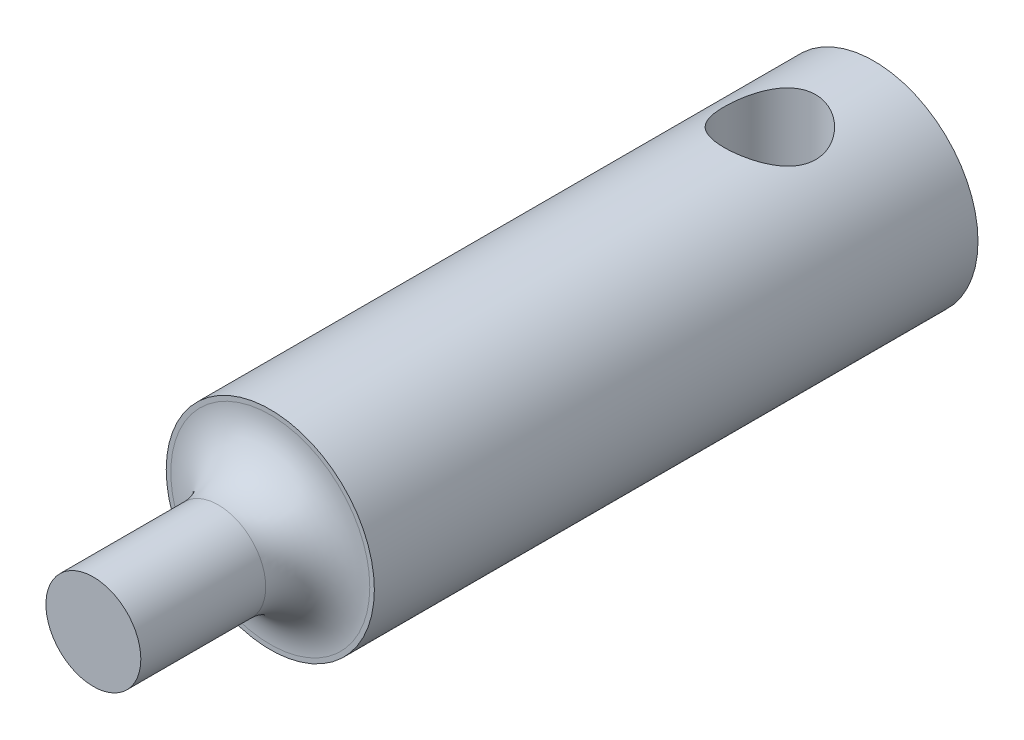
ISO-10303-21;
HEADER;
FILE_DESCRIPTION(('STEP AP214'),'2;1');
FILE_NAME('part.step','',(''),(''),'','','');
FILE_SCHEMA(('AUTOMOTIVE_DESIGN { 1 0 10303 214 1 1 1 1 }'));
ENDSEC;
DATA;
#1=APPLICATION_CONTEXT('core data for automotive mechanical design processes');
#2=APPLICATION_PROTOCOL_DEFINITION('international standard','automotive_design',2000,#1);
#3=PRODUCT_CONTEXT('',#1,'mechanical');
#4=PRODUCT('Part','Part','',(#3));
#5=PRODUCT_RELATED_PRODUCT_CATEGORY('part','',(#4));
#6=PRODUCT_DEFINITION_FORMATION('','',#4);
#7=PRODUCT_DEFINITION_CONTEXT('part definition',#1,'design');
#8=PRODUCT_DEFINITION('design','',#6,#7);
#9=PRODUCT_DEFINITION_SHAPE('','',#8);
#10=(LENGTH_UNIT() NAMED_UNIT(*) SI_UNIT(.MILLI.,.METRE.));
#11=(NAMED_UNIT(*) PLANE_ANGLE_UNIT() SI_UNIT($,.RADIAN.));
#12=(NAMED_UNIT(*) SI_UNIT($,.STERADIAN.) SOLID_ANGLE_UNIT());
#13=UNCERTAINTY_MEASURE_WITH_UNIT(LENGTH_MEASURE(1.E-05),#10,'distance_accuracy_value','');
#14=(GEOMETRIC_REPRESENTATION_CONTEXT(3) GLOBAL_UNCERTAINTY_ASSIGNED_CONTEXT((#13)) GLOBAL_UNIT_ASSIGNED_CONTEXT((#10,
#11,#12)) REPRESENTATION_CONTEXT('',''));
#15=CARTESIAN_POINT('',(0.,0.,0.));
#16=DIRECTION('',(0.,0.,1.));
#17=DIRECTION('',(1.,0.,0.));
#18=AXIS2_PLACEMENT_3D('',#15,#16,#17);
#19=CARTESIAN_POINT('',(0.,0.,18.415));
#20=DIRECTION('',(0.,0.,-1.));
#21=DIRECTION('',(-1.,0.,0.));
#22=AXIS2_PLACEMENT_3D('',#19,#20,#21);
#23=CYLINDRICAL_SURFACE('',#22,3.175);
#24=CARTESIAN_POINT('',(0.,-3.175,4.572));
#25=CARTESIAN_POINT('',(0.0744564190651468,-3.1749972697175,4.57199664569768));
#26=CARTESIAN_POINT('',(0.149031273122387,-3.17235155801961,4.56601246659158));
#27=CARTESIAN_POINT('',(0.296039798164434,-3.16203174722011,4.5423109077335));
#28=CARTESIAN_POINT('',(0.368467798046776,-3.15434538934556,4.52456492232665));
#29=CARTESIAN_POINT('',(0.508823263085735,-3.1347611016683,4.47813115421474));
#30=CARTESIAN_POINT('',(0.57676567151627,-3.12287809055694,4.44948210319816));
#31=CARTESIAN_POINT('',(0.706806619866245,-3.09603999620989,4.38222661670943));
#32=CARTESIAN_POINT('',(0.768906557449635,-3.0810856504523,4.34362257102795));
#33=CARTESIAN_POINT('',(0.889001385568666,-3.04866561325675,4.2553306209959));
#34=CARTESIAN_POINT('',(0.94663570241052,-3.03111173335851,4.20518498376154));
#35=CARTESIAN_POINT('',(1.05299304784798,-2.99582653314941,4.09620448690013));
#36=CARTESIAN_POINT('',(1.10171086925443,-2.97809511549147,4.03736458588414));
#37=CARTESIAN_POINT('',(1.19157494413013,-2.94333608827926,3.90865994367032));
#38=CARTESIAN_POINT('',(1.23214034265897,-2.9264043383319,3.83836095590894));
#39=CARTESIAN_POINT('',(1.30071006133891,-2.89658190749762,3.69109012039759));
#40=CARTESIAN_POINT('',(1.32872157589198,-2.88368891335211,3.61412212479435));
#41=CARTESIAN_POINT('',(1.36985689697246,-2.8643694564486,3.45984514555113));
#42=CARTESIAN_POINT('',(1.38367826410125,-2.8576419635905,3.38276141789925));
#43=CARTESIAN_POINT('',(1.39821119689305,-2.85056187101853,3.2270982331114));
#44=CARTESIAN_POINT('',(1.39893125309836,-2.8502051426179,3.1485197777215));
#45=CARTESIAN_POINT('',(1.38776218669604,-2.85565516755235,2.99943869373256));
#46=CARTESIAN_POINT('',(1.37696906778601,-2.8609262205847,2.92883023597399));
#47=CARTESIAN_POINT('',(1.34493440853301,-2.8761236727019,2.79055302897992));
#48=CARTESIAN_POINT('',(1.32369058064341,-2.88605109099235,2.7228849268872));
#49=CARTESIAN_POINT('',(1.27093683353658,-2.90967222295584,2.59060786925034));
#50=CARTESIAN_POINT('',(1.23920866348139,-2.92344494589061,2.52610070597666));
#51=CARTESIAN_POINT('',(1.16654335034618,-2.95319161304987,2.40305684964162));
#52=CARTESIAN_POINT('',(1.12560236509517,-2.9691664745883,2.34452266243439));
#53=CARTESIAN_POINT('',(1.03110264439394,-3.00336594395861,2.2292157740948));
#54=CARTESIAN_POINT('',(0.976713392224455,-3.02165988813625,2.17314221961801));
#55=CARTESIAN_POINT('',(0.859144915804759,-3.05716600774922,2.07066209299836));
#56=CARTESIAN_POINT('',(0.795963146130486,-3.07437786782005,2.02425832999984));
#57=CARTESIAN_POINT('',(0.660269140668879,-3.10638995837448,1.94124419099494));
#58=CARTESIAN_POINT('',(0.587542737922723,-3.1211077325569,1.90494968125079));
#59=CARTESIAN_POINT('',(0.436202575205566,-3.14582497447425,1.84536157849426));
#60=CARTESIAN_POINT('',(0.35759248621454,-3.15582735628942,1.8220599543355));
#61=CARTESIAN_POINT('',(0.202531325958193,-3.16942296938574,1.79065509209408));
#62=CARTESIAN_POINT('',(0.126304497724904,-3.17341020374002,1.78161555070473));
#63=CARTESIAN_POINT('',(-0.0266763697646318,-3.17580819231337,1.77616127781661));
#64=CARTESIAN_POINT('',(-0.103430226294036,-3.17422079064172,1.77974237136863));
#65=CARTESIAN_POINT('',(-0.250692367232269,-3.16589865049171,1.79878666713704));
#66=CARTESIAN_POINT('',(-0.321308044540988,-3.15946081694563,1.81356476180629));
#67=CARTESIAN_POINT('',(-0.458963554091254,-3.1424179690666,1.85359863621278));
#68=CARTESIAN_POINT('',(-0.526002947592838,-3.13181244476883,1.87885569819313));
#69=CARTESIAN_POINT('',(-0.656978790496382,-3.10702227209116,1.93993998957008));
#70=CARTESIAN_POINT('',(-0.720752909290198,-3.0927361748571,1.97607274267112));
#71=CARTESIAN_POINT('',(-0.841562873448109,-3.06207246558877,2.05754961123733));
#72=CARTESIAN_POINT('',(-0.898595780339054,-3.04569394790049,2.10289772039836));
#73=CARTESIAN_POINT('',(-1.00906061977775,-3.01098555163604,2.20570180674664));
#74=CARTESIAN_POINT('',(-1.06185039988072,-2.99260382159021,2.26383196590513));
#75=CARTESIAN_POINT('',(-1.1571355626495,-2.95706854819179,2.38836436486096));
#76=CARTESIAN_POINT('',(-1.19962752615985,-2.93991541409454,2.45476934107198));
#77=CARTESIAN_POINT('',(-1.27389206106194,-2.90852043596717,2.59594638605302));
#78=CARTESIAN_POINT('',(-1.3054099402624,-2.8943504473103,2.67086965374689));
#79=CARTESIAN_POINT('',(-1.35508629145144,-2.871433087851,2.82578643723246));
#80=CARTESIAN_POINT('',(-1.37325750086315,-2.86268054815289,2.90577503949501));
#81=CARTESIAN_POINT('',(-1.3943933250109,-2.85244063214946,3.06135249252185));
#82=CARTESIAN_POINT('',(-1.39850196981022,-2.85040717538275,3.13675030484026));
#83=CARTESIAN_POINT('',(-1.39452092871853,-2.85235733736492,3.28713534767706));
#84=CARTESIAN_POINT('',(-1.38643370787601,-2.85633974017861,3.36212265809239));
#85=CARTESIAN_POINT('',(-1.35928595154649,-2.86935021801101,3.50505956379995));
#86=CARTESIAN_POINT('',(-1.34088686632541,-2.87807326788967,3.57316539449726));
#87=CARTESIAN_POINT('',(-1.2943270389732,-2.89930915603842,3.70531921774281));
#88=CARTESIAN_POINT('',(-1.26616348853013,-2.9118230844544,3.76936603662299));
#89=CARTESIAN_POINT('',(-1.19882490164752,-2.94021388830471,3.89603804310713));
#90=CARTESIAN_POINT('',(-1.15906396619681,-2.95625390695898,3.95831440589764));
#91=CARTESIAN_POINT('',(-1.0704298381241,-2.9894888872669,4.07566700131294));
#92=CARTESIAN_POINT('',(-1.02155293772951,-3.00668431703843,4.13074028864065));
#93=CARTESIAN_POINT('',(-0.911158079874127,-3.04204692329221,4.23695709696283));
#94=CARTESIAN_POINT('',(-0.848918667862615,-3.06017241605804,4.28736837543166));
#95=CARTESIAN_POINT('',(-0.716221106903045,-3.09391870147354,4.37710207851786));
#96=CARTESIAN_POINT('',(-0.645759238401422,-3.10953835292118,4.41641945693781));
#97=CARTESIAN_POINT('',(-0.499332328363888,-3.13636159423796,4.482149208206));
#98=CARTESIAN_POINT('',(-0.423445645742702,-3.14761714397743,4.50871438031501));
#99=CARTESIAN_POINT('',(-0.267788117469725,-3.16464838557443,4.54843025354274));
#100=CARTESIAN_POINT('',(-0.188029968198447,-3.17044086511387,4.56162205962014));
#101=CARTESIAN_POINT('',(-0.0898516016685383,-3.17377982747286,4.56922439020011));
#102=CARTESIAN_POINT('',(-0.0719020478213308,-3.17423662761183,4.57026429916457));
#103=CARTESIAN_POINT('',(-0.0359706339290712,-3.17484704521294,4.57165251272826));
#104=CARTESIAN_POINT('',(-0.017988773562416,-3.17500065964002,4.57200081040407));
#105=CARTESIAN_POINT('',(0.,-3.175,4.572));
#106=B_SPLINE_CURVE_WITH_KNOTS('',3,(#24,#25,#26,#27,#28,#29,#30,#31,#32,#33,#34,#35,#36,#37,
#38,#39,#40,#41,#42,#43,#44,#45,#46,#47,#48,#49,#50,#51,#52,#53,#54,#55,#56,#57,#58,#59,#60,#61,
#62,#63,#64,#65,#66,#67,#68,#69,#70,#71,#72,#73,#74,#75,#76,#77,#78,#79,#80,#81,#82,#83,#84,#85,
#86,#87,#88,#89,#90,#91,#92,#93,#94,#95,#96,#97,#98,#99,#100,#101,#102,#103,#104,#105),
.UNSPECIFIED.,.T.,.F.,(4,2,2,2,2,2,2,2,2,2,2,2,2,2,2,2,2,2,2,2,2,2,2,2,2,2,2,2,2,2,2,2,2,2,2,2,
2,2,2,2,4),(0.,0.223295218591963,0.447135511662714,0.670187954010603,0.893186900274792,
1.1273373394776,1.36162408806784,1.60910396658315,1.85644183696743,2.09093583844034,
2.3252778664034,2.53914850430462,2.75306597700807,2.97175108558556,3.19052756557462,
3.43014775773771,3.66983746455175,3.91634027214457,4.16269054233982,4.39207237099429,
4.62137832647887,4.83768488917245,5.05401792770384,5.27710827188312,5.50029550459777,
5.74114517889955,5.98207471262448,6.22827213612666,6.47423429420711,6.69963893554446,
6.92499802382995,7.13732805318697,7.34971920051268,7.57560381775455,7.80158051109822,
8.04677045714774,8.29207175174142,8.53435551125926,8.77589229817806,8.82984019099,
8.8837886238485),.UNSPECIFIED.);
#107=CARTESIAN_POINT('',(0.,-3.175,4.572));
#108=VERTEX_POINT('',#107);
#109=EDGE_CURVE('E10',#108,#108,#106,.T.);
#110=ORIENTED_EDGE('',*,*,#109,.T.);
#111=EDGE_LOOP('',(#110));
#112=FACE_BOUND('',#111,.T.);
#113=CARTESIAN_POINT('',(0.,3.175,4.572));
#114=CARTESIAN_POINT('',(-0.0744564190651468,3.1749972697175,4.57199664569768));
#115=CARTESIAN_POINT('',(-0.149031273122387,3.17235155801961,4.56601246659158));
#116=CARTESIAN_POINT('',(-0.296039798164434,3.16203174722011,4.5423109077335));
#117=CARTESIAN_POINT('',(-0.368467798046776,3.15434538934556,4.52456492232665));
#118=CARTESIAN_POINT('',(-0.508823263085735,3.1347611016683,4.47813115421474));
#119=CARTESIAN_POINT('',(-0.57676567151627,3.12287809055694,4.44948210319816));
#120=CARTESIAN_POINT('',(-0.706806619866245,3.09603999620989,4.38222661670943));
#121=CARTESIAN_POINT('',(-0.768906557449635,3.0810856504523,4.34362257102795));
#122=CARTESIAN_POINT('',(-0.889001385568666,3.04866561325675,4.2553306209959));
#123=CARTESIAN_POINT('',(-0.94663570241052,3.03111173335851,4.20518498376154));
#124=CARTESIAN_POINT('',(-1.05299304784798,2.99582653314941,4.09620448690013));
#125=CARTESIAN_POINT('',(-1.10171086925443,2.97809511549147,4.03736458588414));
#126=CARTESIAN_POINT('',(-1.19157494413013,2.94333608827926,3.90865994367032));
#127=CARTESIAN_POINT('',(-1.23214034265897,2.9264043383319,3.83836095590894));
#128=CARTESIAN_POINT('',(-1.30071006133891,2.89658190749762,3.69109012039759));
#129=CARTESIAN_POINT('',(-1.32872157589198,2.88368891335211,3.61412212479435));
#130=CARTESIAN_POINT('',(-1.36985689697246,2.8643694564486,3.45984514555113));
#131=CARTESIAN_POINT('',(-1.38367826410125,2.8576419635905,3.38276141789925));
#132=CARTESIAN_POINT('',(-1.39821119689305,2.85056187101853,3.2270982331114));
#133=CARTESIAN_POINT('',(-1.39893125309836,2.8502051426179,3.1485197777215));
#134=CARTESIAN_POINT('',(-1.38776218669604,2.85565516755235,2.99943869373256));
#135=CARTESIAN_POINT('',(-1.37696906778601,2.8609262205847,2.92883023597399));
#136=CARTESIAN_POINT('',(-1.34493440853301,2.8761236727019,2.79055302897992));
#137=CARTESIAN_POINT('',(-1.32369058064341,2.88605109099235,2.7228849268872));
#138=CARTESIAN_POINT('',(-1.27093683353658,2.90967222295584,2.59060786925034));
#139=CARTESIAN_POINT('',(-1.23920866348139,2.92344494589061,2.52610070597666));
#140=CARTESIAN_POINT('',(-1.16654335034618,2.95319161304987,2.40305684964162));
#141=CARTESIAN_POINT('',(-1.12560236509517,2.9691664745883,2.34452266243439));
#142=CARTESIAN_POINT('',(-1.03110264439394,3.00336594395861,2.2292157740948));
#143=CARTESIAN_POINT('',(-0.976713392224455,3.02165988813625,2.17314221961801));
#144=CARTESIAN_POINT('',(-0.859144915804759,3.05716600774922,2.07066209299836));
#145=CARTESIAN_POINT('',(-0.795963146130486,3.07437786782005,2.02425832999984));
#146=CARTESIAN_POINT('',(-0.660269140668879,3.10638995837448,1.94124419099494));
#147=CARTESIAN_POINT('',(-0.587542737922723,3.1211077325569,1.90494968125079));
#148=CARTESIAN_POINT('',(-0.436202575205566,3.14582497447425,1.84536157849426));
#149=CARTESIAN_POINT('',(-0.35759248621454,3.15582735628942,1.8220599543355));
#150=CARTESIAN_POINT('',(-0.202531325958193,3.16942296938574,1.79065509209408));
#151=CARTESIAN_POINT('',(-0.126304497724904,3.17341020374002,1.78161555070473));
#152=CARTESIAN_POINT('',(0.0266763697646318,3.17580819231337,1.77616127781661));
#153=CARTESIAN_POINT('',(0.103430226294036,3.17422079064172,1.77974237136863));
#154=CARTESIAN_POINT('',(0.250692367232269,3.16589865049171,1.79878666713704));
#155=CARTESIAN_POINT('',(0.321308044540988,3.15946081694563,1.81356476180629));
#156=CARTESIAN_POINT('',(0.458963554091254,3.1424179690666,1.85359863621278));
#157=CARTESIAN_POINT('',(0.526002947592838,3.13181244476883,1.87885569819313));
#158=CARTESIAN_POINT('',(0.656978790496382,3.10702227209116,1.93993998957008));
#159=CARTESIAN_POINT('',(0.720752909290198,3.0927361748571,1.97607274267112));
#160=CARTESIAN_POINT('',(0.841562873448109,3.06207246558877,2.05754961123733));
#161=CARTESIAN_POINT('',(0.898595780339054,3.04569394790049,2.10289772039836));
#162=CARTESIAN_POINT('',(1.00906061977775,3.01098555163604,2.20570180674664));
#163=CARTESIAN_POINT('',(1.06185039988072,2.99260382159021,2.26383196590513));
#164=CARTESIAN_POINT('',(1.1571355626495,2.95706854819179,2.38836436486096));
#165=CARTESIAN_POINT('',(1.19962752615985,2.93991541409454,2.45476934107198));
#166=CARTESIAN_POINT('',(1.27389206106194,2.90852043596717,2.59594638605302));
#167=CARTESIAN_POINT('',(1.3054099402624,2.8943504473103,2.67086965374689));
#168=CARTESIAN_POINT('',(1.35508629145144,2.871433087851,2.82578643723246));
#169=CARTESIAN_POINT('',(1.37325750086315,2.86268054815289,2.90577503949501));
#170=CARTESIAN_POINT('',(1.3943933250109,2.85244063214946,3.06135249252185));
#171=CARTESIAN_POINT('',(1.39850196981022,2.85040717538275,3.13675030484026));
#172=CARTESIAN_POINT('',(1.39452092871853,2.85235733736492,3.28713534767706));
#173=CARTESIAN_POINT('',(1.38643370787601,2.85633974017861,3.36212265809239));
#174=CARTESIAN_POINT('',(1.35928595154649,2.86935021801101,3.50505956379995));
#175=CARTESIAN_POINT('',(1.34088686632541,2.87807326788967,3.57316539449726));
#176=CARTESIAN_POINT('',(1.2943270389732,2.89930915603842,3.70531921774281));
#177=CARTESIAN_POINT('',(1.26616348853013,2.9118230844544,3.76936603662299));
#178=CARTESIAN_POINT('',(1.19882490164752,2.94021388830471,3.89603804310713));
#179=CARTESIAN_POINT('',(1.15906396619681,2.95625390695898,3.95831440589764));
#180=CARTESIAN_POINT('',(1.0704298381241,2.9894888872669,4.07566700131294));
#181=CARTESIAN_POINT('',(1.02155293772951,3.00668431703843,4.13074028864065));
#182=CARTESIAN_POINT('',(0.911158079874127,3.04204692329221,4.23695709696283));
#183=CARTESIAN_POINT('',(0.848918667862615,3.06017241605804,4.28736837543166));
#184=CARTESIAN_POINT('',(0.716221106903045,3.09391870147354,4.37710207851786));
#185=CARTESIAN_POINT('',(0.645759238401422,3.10953835292118,4.41641945693781));
#186=CARTESIAN_POINT('',(0.499332328363888,3.13636159423796,4.482149208206));
#187=CARTESIAN_POINT('',(0.423445645742702,3.14761714397743,4.50871438031501));
#188=CARTESIAN_POINT('',(0.267788117469725,3.16464838557443,4.54843025354274));
#189=CARTESIAN_POINT('',(0.188029968198447,3.17044086511387,4.56162205962014));
#190=CARTESIAN_POINT('',(0.0898516016685383,3.17377982747286,4.56922439020011));
#191=CARTESIAN_POINT('',(0.0719020478213308,3.17423662761183,4.57026429916457));
#192=CARTESIAN_POINT('',(0.0359706339290712,3.17484704521294,4.57165251272826));
#193=CARTESIAN_POINT('',(0.017988773562416,3.17500065964002,4.57200081040407));
#194=CARTESIAN_POINT('',(0.,3.175,4.572));
#195=B_SPLINE_CURVE_WITH_KNOTS('',3,(#113,#114,#115,#116,#117,#118,#119,#120,#121,#122,#123,
#124,#125,#126,#127,#128,#129,#130,#131,#132,#133,#134,#135,#136,#137,#138,#139,#140,#141,#142,
#143,#144,#145,#146,#147,#148,#149,#150,#151,#152,#153,#154,#155,#156,#157,#158,#159,#160,#161,
#162,#163,#164,#165,#166,#167,#168,#169,#170,#171,#172,#173,#174,#175,#176,#177,#178,#179,#180,
#181,#182,#183,#184,#185,#186,#187,#188,#189,#190,#191,#192,#193,#194),.UNSPECIFIED.,.T.,.F.,(4,
2,2,2,2,2,2,2,2,2,2,2,2,2,2,2,2,2,2,2,2,2,2,2,2,2,2,2,2,2,2,2,2,2,2,2,2,2,2,2,4),(0.,
0.223295218591963,0.447135511662714,0.670187954010603,0.893186900274792,1.1273373394776,
1.36162408806784,1.60910396658315,1.85644183696743,2.09093583844034,2.3252778664034,
2.53914850430462,2.75306597700807,2.97175108558556,3.19052756557462,3.43014775773771,
3.66983746455175,3.91634027214457,4.16269054233982,4.39207237099429,4.62137832647887,
4.83768488917245,5.05401792770384,5.27710827188312,5.50029550459777,5.74114517889955,
5.98207471262448,6.22827213612666,6.47423429420711,6.69963893554446,6.92499802382995,
7.13732805318697,7.34971920051268,7.57560381775455,7.80158051109822,8.04677045714774,
8.29207175174142,8.53435551125926,8.77589229817806,8.82984019099,8.8837886238485),.UNSPECIFIED.);
#196=CARTESIAN_POINT('',(0.,3.175,4.572));
#197=VERTEX_POINT('',#196);
#198=EDGE_CURVE('E49',#197,#197,#195,.T.);
#199=ORIENTED_EDGE('',*,*,#198,.T.);
#200=EDGE_LOOP('',(#199));
#201=FACE_BOUND('',#200,.T.);
#202=CARTESIAN_POINT('',(0.,0.,18.415));
#203=DIRECTION('',(0.,0.,1.));
#204=DIRECTION('',(1.,0.,0.));
#205=AXIS2_PLACEMENT_3D('',#202,#203,#204);
#206=CIRCLE('',#205,3.175);
#207=CARTESIAN_POINT('',(3.175,0.,18.415));
#208=VERTEX_POINT('',#207);
#209=EDGE_CURVE('E97',#208,#208,#206,.T.);
#210=ORIENTED_EDGE('',*,*,#209,.F.);
#211=EDGE_LOOP('',(#210));
#212=FACE_BOUND('',#211,.T.);
#213=CARTESIAN_POINT('',(0.,0.,0.));
#214=DIRECTION('',(0.,0.,1.));
#215=DIRECTION('',(1.,0.,0.));
#216=AXIS2_PLACEMENT_3D('',#213,#214,#215);
#217=CIRCLE('',#216,3.175);
#218=CARTESIAN_POINT('',(3.175,0.,0.));
#219=VERTEX_POINT('',#218);
#220=EDGE_CURVE('E99',#219,#219,#217,.T.);
#221=ORIENTED_EDGE('',*,*,#220,.T.);
#222=EDGE_LOOP('',(#221));
#223=FACE_BOUND('',#222,.T.);
#224=ADVANCED_FACE('F37',(#112,#201,#212,#223),#23,.T.);
#225=CARTESIAN_POINT('',(0.,0.,18.415));
#226=DIRECTION('',(0.,0.,1.));
#227=DIRECTION('',(1.,0.,0.));
#228=AXIS2_PLACEMENT_3D('',#225,#226,#227);
#229=PLANE('',#228);
#230=CARTESIAN_POINT('',(0.,0.,18.415));
#231=DIRECTION('',(0.,0.,1.));
#232=DIRECTION('',(1.,0.,0.));
#233=AXIS2_PLACEMENT_3D('',#230,#231,#232);
#234=CIRCLE('',#233,3.0353);
#235=CARTESIAN_POINT('',(3.0353,0.,18.415));
#236=VERTEX_POINT('',#235);
#237=EDGE_CURVE('E54',#236,#236,#234,.F.);
#238=ORIENTED_EDGE('',*,*,#237,.T.);
#239=EDGE_LOOP('',(#238));
#240=FACE_BOUND('',#239,.T.);
#241=ORIENTED_EDGE('',*,*,#209,.T.);
#242=EDGE_LOOP('',(#241));
#243=FACE_BOUND('',#242,.T.);
#244=ADVANCED_FACE('F82',(#240,#243),#229,.T.);
#245=CARTESIAN_POINT('',(0.,0.,0.));
#246=DIRECTION('',(0.,0.,1.));
#247=DIRECTION('',(1.,0.,0.));
#248=AXIS2_PLACEMENT_3D('',#245,#246,#247);
#249=PLANE('',#248);
#250=ORIENTED_EDGE('',*,*,#220,.F.);
#251=EDGE_LOOP('',(#250));
#252=FACE_BOUND('',#251,.T.);
#253=ADVANCED_FACE('F80',(#252),#249,.F.);
#254=CARTESIAN_POINT('',(0.,0.,23.8125));
#255=DIRECTION('',(0.,0.,-1.));
#256=DIRECTION('',(-1.,0.,0.));
#257=AXIS2_PLACEMENT_3D('',#254,#255,#256);
#258=CYLINDRICAL_SURFACE('',#257,1.4478);
#259=CARTESIAN_POINT('',(0.,0.,20.0025));
#260=DIRECTION('',(0.,0.,1.));
#261=DIRECTION('',(1.,0.,0.));
#262=AXIS2_PLACEMENT_3D('',#259,#260,#261);
#263=CIRCLE('',#262,1.4478);
#264=CARTESIAN_POINT('',(1.4478,0.,20.0025));
#265=VERTEX_POINT('',#264);
#266=EDGE_CURVE('E59',#265,#265,#263,.T.);
#267=ORIENTED_EDGE('',*,*,#266,.T.);
#268=EDGE_LOOP('',(#267));
#269=FACE_BOUND('',#268,.T.);
#270=CARTESIAN_POINT('',(0.,0.,23.8125));
#271=DIRECTION('',(0.,0.,1.));
#272=DIRECTION('',(1.,0.,0.));
#273=AXIS2_PLACEMENT_3D('',#270,#271,#272);
#274=CIRCLE('',#273,1.4478);
#275=CARTESIAN_POINT('',(1.4478,0.,23.8125));
#276=VERTEX_POINT('',#275);
#277=EDGE_CURVE('E101',#276,#276,#274,.T.);
#278=ORIENTED_EDGE('',*,*,#277,.F.);
#279=EDGE_LOOP('',(#278));
#280=FACE_BOUND('',#279,.T.);
#281=ADVANCED_FACE('F76',(#269,#280),#258,.T.);
#282=CARTESIAN_POINT('',(0.,0.,23.8125));
#283=DIRECTION('',(0.,0.,1.));
#284=DIRECTION('',(1.,0.,0.));
#285=AXIS2_PLACEMENT_3D('',#282,#283,#284);
#286=PLANE('',#285);
#287=ORIENTED_EDGE('',*,*,#277,.T.);
#288=EDGE_LOOP('',(#287));
#289=FACE_BOUND('',#288,.T.);
#290=ADVANCED_FACE('F72',(#289),#286,.T.);
#291=CARTESIAN_POINT('',(0.,0.,20.0025));
#292=DIRECTION('',(0.,0.,1.));
#293=DIRECTION('',(1.,0.,0.));
#294=AXIS2_PLACEMENT_3D('',#291,#292,#293);
#295=TOROIDAL_SURFACE('',#294,3.0353,1.5875);
#296=ORIENTED_EDGE('',*,*,#237,.F.);
#297=EDGE_LOOP('',(#296));
#298=FACE_BOUND('',#297,.T.);
#299=ORIENTED_EDGE('',*,*,#266,.F.);
#300=EDGE_LOOP('',(#299));
#301=FACE_BOUND('',#300,.T.);
#302=ADVANCED_FACE('F39',(#298,#301),#295,.F.);
#303=CARTESIAN_POINT('',(0.,-3.175,3.175));
#304=DIRECTION('',(0.,1.,0.));
#305=DIRECTION('',(0.,0.,1.));
#306=AXIS2_PLACEMENT_3D('',#303,#304,#305);
#307=CYLINDRICAL_SURFACE('',#306,1.397);
#308=ORIENTED_EDGE('',*,*,#198,.F.);
#309=EDGE_LOOP('',(#308));
#310=FACE_BOUND('',#309,.T.);
#311=ORIENTED_EDGE('',*,*,#109,.F.);
#312=EDGE_LOOP('',(#311));
#313=FACE_BOUND('',#312,.T.);
#314=ADVANCED_FACE('F67',(#310,#313),#307,.F.);
#315=CLOSED_SHELL('',(#224,#244,#253,#281,#290,#302,#314));
#316=MANIFOLD_SOLID_BREP('B2',#315);
#317=ADVANCED_BREP_SHAPE_REPRESENTATION('',(#18,#316),#14);
#318=SHAPE_DEFINITION_REPRESENTATION(#9,#317);
ENDSEC;
END-ISO-10303-21;
